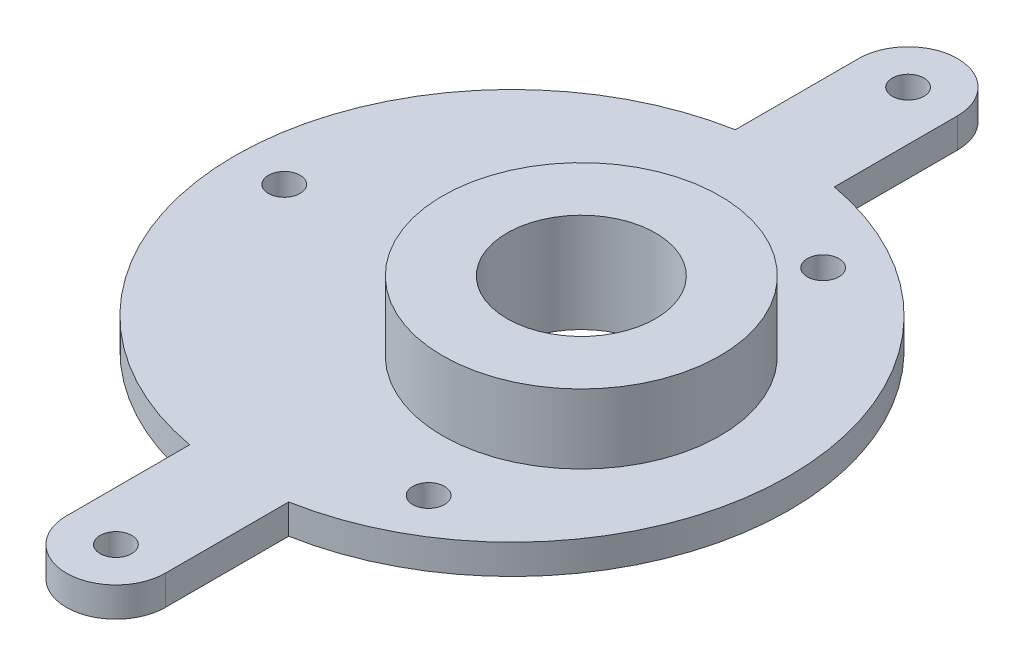
ISO-10303-21;
HEADER;
FILE_DESCRIPTION(('STEP AP214'),'2;1');
FILE_NAME('part.step','',(''),(''),'','','');
FILE_SCHEMA(('AUTOMOTIVE_DESIGN { 1 0 10303 214 1 1 1 1 }'));
ENDSEC;
DATA;
#1=APPLICATION_CONTEXT('core data for automotive mechanical design processes');
#2=APPLICATION_PROTOCOL_DEFINITION('international standard','automotive_design',2000,#1);
#3=PRODUCT_CONTEXT('',#1,'mechanical');
#4=PRODUCT('Part','Part','',(#3));
#5=PRODUCT_RELATED_PRODUCT_CATEGORY('part','',(#4));
#6=PRODUCT_DEFINITION_FORMATION('','',#4);
#7=PRODUCT_DEFINITION_CONTEXT('part definition',#1,'design');
#8=PRODUCT_DEFINITION('design','',#6,#7);
#9=PRODUCT_DEFINITION_SHAPE('','',#8);
#10=(LENGTH_UNIT() NAMED_UNIT(*) SI_UNIT(.MILLI.,.METRE.));
#11=(NAMED_UNIT(*) PLANE_ANGLE_UNIT() SI_UNIT($,.RADIAN.));
#12=(NAMED_UNIT(*) SI_UNIT($,.STERADIAN.) SOLID_ANGLE_UNIT());
#13=UNCERTAINTY_MEASURE_WITH_UNIT(LENGTH_MEASURE(1.E-05),#10,'distance_accuracy_value','');
#14=(GEOMETRIC_REPRESENTATION_CONTEXT(3) GLOBAL_UNCERTAINTY_ASSIGNED_CONTEXT((#13)) GLOBAL_UNIT_ASSIGNED_CONTEXT((#10,
#11,#12)) REPRESENTATION_CONTEXT('',''));
#15=CARTESIAN_POINT('',(0.,0.,0.));
#16=DIRECTION('',(0.,0.,1.));
#17=DIRECTION('',(1.,0.,0.));
#18=AXIS2_PLACEMENT_3D('',#15,#16,#17);
#19=CARTESIAN_POINT('',(0.,3.,0.));
#20=DIRECTION('',(0.,1.,0.));
#21=DIRECTION('',(0.,0.,1.));
#22=AXIS2_PLACEMENT_3D('',#19,#20,#21);
#23=PLANE('',#22);
#24=CARTESIAN_POINT('',(-23.,3.,0.));
#25=DIRECTION('',(0.,1.,0.));
#26=DIRECTION('',(0.,0.,1.));
#27=AXIS2_PLACEMENT_3D('',#24,#25,#26);
#28=CIRCLE('',#27,1.6);
#29=CARTESIAN_POINT('',(-23.,3.,1.6));
#30=VERTEX_POINT('',#29);
#31=EDGE_CURVE('E214',#30,#30,#28,.T.);
#32=ORIENTED_EDGE('',*,*,#31,.F.);
#33=EDGE_LOOP('',(#32));
#34=FACE_BOUND('',#33,.T.);
#35=CARTESIAN_POINT('',(11.5,3.,-19.9185842870421));
#36=DIRECTION('',(0.,1.,0.));
#37=DIRECTION('',(0.,0.,1.));
#38=AXIS2_PLACEMENT_3D('',#35,#36,#37);
#39=CIRCLE('',#38,1.6);
#40=CARTESIAN_POINT('',(11.5,3.,-18.3185842870421));
#41=VERTEX_POINT('',#40);
#42=EDGE_CURVE('E208',#41,#41,#39,.T.);
#43=ORIENTED_EDGE('',*,*,#42,.F.);
#44=EDGE_LOOP('',(#43));
#45=FACE_BOUND('',#44,.T.);
#46=CARTESIAN_POINT('',(11.5,3.,19.9185842870421));
#47=DIRECTION('',(0.,1.,0.));
#48=DIRECTION('',(0.,0.,1.));
#49=AXIS2_PLACEMENT_3D('',#46,#47,#48);
#50=CIRCLE('',#49,1.6);
#51=CARTESIAN_POINT('',(11.5,3.,21.5185842870421));
#52=VERTEX_POINT('',#51);
#53=EDGE_CURVE('E202',#52,#52,#50,.T.);
#54=ORIENTED_EDGE('',*,*,#53,.F.);
#55=EDGE_LOOP('',(#54));
#56=FACE_BOUND('',#55,.T.);
#57=CARTESIAN_POINT('',(7.,3.,0.));
#58=DIRECTION('',(0.,1.,0.));
#59=DIRECTION('',(0.,0.,1.));
#60=AXIS2_PLACEMENT_3D('',#57,#58,#59);
#61=CIRCLE('',#60,14.);
#62=CARTESIAN_POINT('',(7.,3.,14.));
#63=VERTEX_POINT('',#62);
#64=EDGE_CURVE('E190',#63,#63,#61,.T.);
#65=ORIENTED_EDGE('',*,*,#64,.F.);
#66=EDGE_LOOP('',(#65));
#67=FACE_BOUND('',#66,.T.);
#68=CARTESIAN_POINT('',(0.,3.,40.));
#69=DIRECTION('',(0.,1.,0.));
#70=DIRECTION('',(0.,0.,1.));
#71=AXIS2_PLACEMENT_3D('',#68,#69,#70);
#72=CIRCLE('',#71,1.6);
#73=CARTESIAN_POINT('',(0.,3.,41.6));
#74=VERTEX_POINT('',#73);
#75=EDGE_CURVE('E133',#74,#74,#72,.T.);
#76=ORIENTED_EDGE('',*,*,#75,.F.);
#77=EDGE_LOOP('',(#76));
#78=FACE_BOUND('',#77,.T.);
#79=CARTESIAN_POINT('',(0.,3.,0.));
#80=DIRECTION('',(0.,1.,0.));
#81=DIRECTION('',(0.,0.,1.));
#82=AXIS2_PLACEMENT_3D('',#79,#80,#81);
#83=CIRCLE('',#82,28.);
#84=CARTESIAN_POINT('',(5.,3.,27.5499546279118));
#85=VERTEX_POINT('',#84);
#86=CARTESIAN_POINT('',(5.,3.,-27.5499546279118));
#87=VERTEX_POINT('',#86);
#88=EDGE_CURVE('E144',#85,#87,#83,.T.);
#89=ORIENTED_EDGE('',*,*,#88,.T.);
#90=DIRECTION('',(0.,0.,-1.));
#91=VECTOR('',#90,1.);
#92=CARTESIAN_POINT('',(5.,3.,-40.));
#93=LINE('',#92,#91);
#94=CARTESIAN_POINT('',(5.,3.,-40.));
#95=VERTEX_POINT('',#94);
#96=EDGE_CURVE('E92',#87,#95,#93,.T.);
#97=ORIENTED_EDGE('',*,*,#96,.T.);
#98=CARTESIAN_POINT('',(0.,3.,-40.));
#99=DIRECTION('',(0.,1.,0.));
#100=DIRECTION('',(0.,0.,1.));
#101=AXIS2_PLACEMENT_3D('',#98,#99,#100);
#102=CIRCLE('',#101,5.);
#103=CARTESIAN_POINT('',(-5.,3.,-40.));
#104=VERTEX_POINT('',#103);
#105=EDGE_CURVE('E159',#95,#104,#102,.T.);
#106=ORIENTED_EDGE('',*,*,#105,.T.);
#107=DIRECTION('',(0.,0.,1.));
#108=VECTOR('',#107,1.);
#109=CARTESIAN_POINT('',(-5.,3.,-40.));
#110=LINE('',#109,#108);
#111=CARTESIAN_POINT('',(-5.,3.,-27.5499546279118));
#112=VERTEX_POINT('',#111);
#113=EDGE_CURVE('E172',#104,#112,#110,.T.);
#114=ORIENTED_EDGE('',*,*,#113,.T.);
#115=CARTESIAN_POINT('',(0.,3.,0.));
#116=DIRECTION('',(0.,1.,0.));
#117=DIRECTION('',(0.,0.,1.));
#118=AXIS2_PLACEMENT_3D('',#115,#116,#117);
#119=CIRCLE('',#118,28.);
#120=CARTESIAN_POINT('',(-5.,3.,27.5499546279118));
#121=VERTEX_POINT('',#120);
#122=EDGE_CURVE('E111',#112,#121,#119,.T.);
#123=ORIENTED_EDGE('',*,*,#122,.T.);
#124=DIRECTION('',(0.,0.,1.));
#125=VECTOR('',#124,1.);
#126=CARTESIAN_POINT('',(-5.,3.,27.5499546279118));
#127=LINE('',#126,#125);
#128=CARTESIAN_POINT('',(-5.,3.,40.));
#129=VERTEX_POINT('',#128);
#130=EDGE_CURVE('E105',#121,#129,#127,.T.);
#131=ORIENTED_EDGE('',*,*,#130,.T.);
#132=CARTESIAN_POINT('',(0.,3.,40.));
#133=DIRECTION('',(0.,1.,0.));
#134=DIRECTION('',(0.,0.,1.));
#135=AXIS2_PLACEMENT_3D('',#132,#133,#134);
#136=CIRCLE('',#135,5.);
#137=CARTESIAN_POINT('',(5.,3.,40.));
#138=VERTEX_POINT('',#137);
#139=EDGE_CURVE('E109',#129,#138,#136,.T.);
#140=ORIENTED_EDGE('',*,*,#139,.T.);
#141=DIRECTION('',(0.,0.,-1.));
#142=VECTOR('',#141,1.);
#143=CARTESIAN_POINT('',(5.,3.,27.5499546279118));
#144=LINE('',#143,#142);
#145=EDGE_CURVE('E49',#138,#85,#144,.T.);
#146=ORIENTED_EDGE('',*,*,#145,.T.);
#147=EDGE_LOOP('',(#89,#97,#106,#114,#123,#131,#140,#146));
#148=FACE_BOUND('',#147,.T.);
#149=CARTESIAN_POINT('',(0.,3.,-40.));
#150=DIRECTION('',(0.,1.,0.));
#151=DIRECTION('',(0.,0.,1.));
#152=AXIS2_PLACEMENT_3D('',#149,#150,#151);
#153=CIRCLE('',#152,1.6);
#154=CARTESIAN_POINT('',(0.,3.,-38.4));
#155=VERTEX_POINT('',#154);
#156=EDGE_CURVE('E181',#155,#155,#153,.T.);
#157=ORIENTED_EDGE('',*,*,#156,.F.);
#158=EDGE_LOOP('',(#157));
#159=FACE_BOUND('',#158,.T.);
#160=ADVANCED_FACE('F32',(#34,#45,#56,#67,#78,#148,#159),#23,.T.);
#161=CARTESIAN_POINT('',(0.,0.,0.));
#162=DIRECTION('',(0.,1.,0.));
#163=DIRECTION('',(0.,0.,1.));
#164=AXIS2_PLACEMENT_3D('',#161,#162,#163);
#165=PLANE('',#164);
#166=CARTESIAN_POINT('',(-23.,0.,0.));
#167=DIRECTION('',(0.,1.,0.));
#168=DIRECTION('',(0.,0.,1.));
#169=AXIS2_PLACEMENT_3D('',#166,#167,#168);
#170=CIRCLE('',#169,1.6);
#171=CARTESIAN_POINT('',(-23.,0.,1.6));
#172=VERTEX_POINT('',#171);
#173=EDGE_CURVE('E201',#172,#172,#170,.T.);
#174=ORIENTED_EDGE('',*,*,#173,.T.);
#175=EDGE_LOOP('',(#174));
#176=FACE_BOUND('',#175,.T.);
#177=CARTESIAN_POINT('',(11.5,0.,-19.9185842870421));
#178=DIRECTION('',(0.,1.,0.));
#179=DIRECTION('',(0.,0.,1.));
#180=AXIS2_PLACEMENT_3D('',#177,#178,#179);
#181=CIRCLE('',#180,1.6);
#182=CARTESIAN_POINT('',(11.5,0.,-18.3185842870421));
#183=VERTEX_POINT('',#182);
#184=EDGE_CURVE('E211',#183,#183,#181,.T.);
#185=ORIENTED_EDGE('',*,*,#184,.T.);
#186=EDGE_LOOP('',(#185));
#187=FACE_BOUND('',#186,.T.);
#188=CARTESIAN_POINT('',(11.5,0.,19.9185842870421));
#189=DIRECTION('',(0.,1.,0.));
#190=DIRECTION('',(0.,0.,1.));
#191=AXIS2_PLACEMENT_3D('',#188,#189,#190);
#192=CIRCLE('',#191,1.6);
#193=CARTESIAN_POINT('',(11.5,0.,21.5185842870421));
#194=VERTEX_POINT('',#193);
#195=EDGE_CURVE('E205',#194,#194,#192,.T.);
#196=ORIENTED_EDGE('',*,*,#195,.T.);
#197=EDGE_LOOP('',(#196));
#198=FACE_BOUND('',#197,.T.);
#199=CARTESIAN_POINT('',(7.,0.,0.));
#200=DIRECTION('',(0.,1.,0.));
#201=DIRECTION('',(0.,0.,1.));
#202=AXIS2_PLACEMENT_3D('',#199,#200,#201);
#203=CIRCLE('',#202,7.5);
#204=CARTESIAN_POINT('',(7.,0.,7.5));
#205=VERTEX_POINT('',#204);
#206=EDGE_CURVE('E193',#205,#205,#203,.T.);
#207=ORIENTED_EDGE('',*,*,#206,.T.);
#208=EDGE_LOOP('',(#207));
#209=FACE_BOUND('',#208,.T.);
#210=CARTESIAN_POINT('',(0.,0.,0.));
#211=DIRECTION('',(0.,1.,0.));
#212=DIRECTION('',(0.,0.,1.));
#213=AXIS2_PLACEMENT_3D('',#210,#211,#212);
#214=CIRCLE('',#213,28.);
#215=CARTESIAN_POINT('',(5.,0.,27.5499546279118));
#216=VERTEX_POINT('',#215);
#217=CARTESIAN_POINT('',(5.,0.,-27.5499546279118));
#218=VERTEX_POINT('',#217);
#219=EDGE_CURVE('E129',#216,#218,#214,.T.);
#220=ORIENTED_EDGE('',*,*,#219,.F.);
#221=DIRECTION('',(0.,0.,-1.));
#222=VECTOR('',#221,1.);
#223=CARTESIAN_POINT('',(5.,0.,27.5499546279118));
#224=LINE('',#223,#222);
#225=CARTESIAN_POINT('',(5.,0.,40.));
#226=VERTEX_POINT('',#225);
#227=EDGE_CURVE('E84',#226,#216,#224,.T.);
#228=ORIENTED_EDGE('',*,*,#227,.F.);
#229=CARTESIAN_POINT('',(0.,0.,40.));
#230=DIRECTION('',(0.,1.,0.));
#231=DIRECTION('',(0.,0.,1.));
#232=AXIS2_PLACEMENT_3D('',#229,#230,#231);
#233=CIRCLE('',#232,5.);
#234=CARTESIAN_POINT('',(-5.,0.,40.));
#235=VERTEX_POINT('',#234);
#236=EDGE_CURVE('E78',#235,#226,#233,.T.);
#237=ORIENTED_EDGE('',*,*,#236,.F.);
#238=DIRECTION('',(0.,0.,1.));
#239=VECTOR('',#238,1.);
#240=CARTESIAN_POINT('',(-5.,0.,27.5499546279118));
#241=LINE('',#240,#239);
#242=CARTESIAN_POINT('',(-5.,0.,27.5499546279118));
#243=VERTEX_POINT('',#242);
#244=EDGE_CURVE('E119',#243,#235,#241,.T.);
#245=ORIENTED_EDGE('',*,*,#244,.F.);
#246=CARTESIAN_POINT('',(0.,0.,0.));
#247=DIRECTION('',(0.,1.,0.));
#248=DIRECTION('',(0.,0.,1.));
#249=AXIS2_PLACEMENT_3D('',#246,#247,#248);
#250=CIRCLE('',#249,28.);
#251=CARTESIAN_POINT('',(-5.,0.,-27.5499546279118));
#252=VERTEX_POINT('',#251);
#253=EDGE_CURVE('E139',#252,#243,#250,.T.);
#254=ORIENTED_EDGE('',*,*,#253,.F.);
#255=DIRECTION('',(0.,0.,1.));
#256=VECTOR('',#255,1.);
#257=CARTESIAN_POINT('',(-5.,0.,-40.));
#258=LINE('',#257,#256);
#259=CARTESIAN_POINT('',(-5.,0.,-40.));
#260=VERTEX_POINT('',#259);
#261=EDGE_CURVE('E137',#260,#252,#258,.T.);
#262=ORIENTED_EDGE('',*,*,#261,.F.);
#263=CARTESIAN_POINT('',(0.,0.,-40.));
#264=DIRECTION('',(0.,1.,0.));
#265=DIRECTION('',(0.,0.,1.));
#266=AXIS2_PLACEMENT_3D('',#263,#264,#265);
#267=CIRCLE('',#266,5.);
#268=CARTESIAN_POINT('',(5.,0.,-40.));
#269=VERTEX_POINT('',#268);
#270=EDGE_CURVE('E135',#269,#260,#267,.T.);
#271=ORIENTED_EDGE('',*,*,#270,.F.);
#272=DIRECTION('',(0.,0.,-1.));
#273=VECTOR('',#272,1.);
#274=CARTESIAN_POINT('',(5.,0.,-40.));
#275=LINE('',#274,#273);
#276=EDGE_CURVE('E132',#218,#269,#275,.T.);
#277=ORIENTED_EDGE('',*,*,#276,.F.);
#278=EDGE_LOOP('',(#220,#228,#237,#245,#254,#262,#271,#277));
#279=FACE_BOUND('',#278,.T.);
#280=CARTESIAN_POINT('',(0.,0.,40.));
#281=DIRECTION('',(0.,1.,0.));
#282=DIRECTION('',(0.,0.,1.));
#283=AXIS2_PLACEMENT_3D('',#280,#281,#282);
#284=CIRCLE('',#283,1.6);
#285=CARTESIAN_POINT('',(0.,0.,41.6));
#286=VERTEX_POINT('',#285);
#287=EDGE_CURVE('E178',#286,#286,#284,.T.);
#288=ORIENTED_EDGE('',*,*,#287,.T.);
#289=EDGE_LOOP('',(#288));
#290=FACE_BOUND('',#289,.T.);
#291=CARTESIAN_POINT('',(0.,0.,-40.));
#292=DIRECTION('',(0.,1.,0.));
#293=DIRECTION('',(0.,0.,1.));
#294=AXIS2_PLACEMENT_3D('',#291,#292,#293);
#295=CIRCLE('',#294,1.6);
#296=CARTESIAN_POINT('',(0.,0.,-38.4));
#297=VERTEX_POINT('',#296);
#298=EDGE_CURVE('E184',#297,#297,#295,.T.);
#299=ORIENTED_EDGE('',*,*,#298,.T.);
#300=EDGE_LOOP('',(#299));
#301=FACE_BOUND('',#300,.T.);
#302=ADVANCED_FACE('F163',(#176,#187,#198,#209,#279,#290,#301),#165,.F.);
#303=CARTESIAN_POINT('',(0.,3.,0.));
#304=DIRECTION('',(0.,-1.,0.));
#305=DIRECTION('',(0.,0.,-1.));
#306=AXIS2_PLACEMENT_3D('',#303,#304,#305);
#307=CYLINDRICAL_SURFACE('',#306,28.);
#308=ORIENTED_EDGE('',*,*,#219,.T.);
#309=DIRECTION('',(0.,-1.,0.));
#310=VECTOR('',#309,1.);
#311=CARTESIAN_POINT('',(5.,3.,-27.5499546279118));
#312=LINE('',#311,#310);
#313=EDGE_CURVE('E11',#87,#218,#312,.T.);
#314=ORIENTED_EDGE('',*,*,#313,.F.);
#315=ORIENTED_EDGE('',*,*,#88,.F.);
#316=DIRECTION('',(0.,-1.,0.));
#317=VECTOR('',#316,1.);
#318=CARTESIAN_POINT('',(5.,3.,27.5499546279118));
#319=LINE('',#318,#317);
#320=EDGE_CURVE('E125',#85,#216,#319,.T.);
#321=ORIENTED_EDGE('',*,*,#320,.T.);
#322=EDGE_LOOP('',(#308,#314,#315,#321));
#323=FACE_BOUND('',#322,.T.);
#324=ADVANCED_FACE('F34',(#323),#307,.T.);
#325=CARTESIAN_POINT('',(5.,3.,-40.));
#326=DIRECTION('',(-1.,0.,0.));
#327=DIRECTION('',(0.,0.,1.));
#328=AXIS2_PLACEMENT_3D('',#325,#326,#327);
#329=PLANE('',#328);
#330=ORIENTED_EDGE('',*,*,#276,.T.);
#331=DIRECTION('',(0.,-1.,0.));
#332=VECTOR('',#331,1.);
#333=CARTESIAN_POINT('',(5.,3.,-40.));
#334=LINE('',#333,#332);
#335=EDGE_CURVE('E41',#95,#269,#334,.T.);
#336=ORIENTED_EDGE('',*,*,#335,.F.);
#337=ORIENTED_EDGE('',*,*,#96,.F.);
#338=ORIENTED_EDGE('',*,*,#313,.T.);
#339=EDGE_LOOP('',(#330,#336,#337,#338));
#340=FACE_BOUND('',#339,.T.);
#341=ADVANCED_FACE('F275',(#340),#329,.F.);
#342=CARTESIAN_POINT('',(0.,3.,-40.));
#343=DIRECTION('',(0.,-1.,0.));
#344=DIRECTION('',(0.,0.,-1.));
#345=AXIS2_PLACEMENT_3D('',#342,#343,#344);
#346=CYLINDRICAL_SURFACE('',#345,5.);
#347=ORIENTED_EDGE('',*,*,#270,.T.);
#348=DIRECTION('',(0.,-1.,0.));
#349=VECTOR('',#348,1.);
#350=CARTESIAN_POINT('',(-5.,3.,-40.));
#351=LINE('',#350,#349);
#352=EDGE_CURVE('E151',#104,#260,#351,.T.);
#353=ORIENTED_EDGE('',*,*,#352,.F.);
#354=ORIENTED_EDGE('',*,*,#105,.F.);
#355=ORIENTED_EDGE('',*,*,#335,.T.);
#356=EDGE_LOOP('',(#347,#353,#354,#355));
#357=FACE_BOUND('',#356,.T.);
#358=ADVANCED_FACE('F157',(#357),#346,.T.);
#359=CARTESIAN_POINT('',(-5.,3.,-40.));
#360=DIRECTION('',(1.,0.,0.));
#361=DIRECTION('',(0.,0.,-1.));
#362=AXIS2_PLACEMENT_3D('',#359,#360,#361);
#363=PLANE('',#362);
#364=ORIENTED_EDGE('',*,*,#261,.T.);
#365=DIRECTION('',(0.,-1.,0.));
#366=VECTOR('',#365,1.);
#367=CARTESIAN_POINT('',(-5.,3.,-27.5499546279118));
#368=LINE('',#367,#366);
#369=EDGE_CURVE('E148',#112,#252,#368,.T.);
#370=ORIENTED_EDGE('',*,*,#369,.F.);
#371=ORIENTED_EDGE('',*,*,#113,.F.);
#372=ORIENTED_EDGE('',*,*,#352,.T.);
#373=EDGE_LOOP('',(#364,#370,#371,#372));
#374=FACE_BOUND('',#373,.T.);
#375=ADVANCED_FACE('F168',(#374),#363,.F.);
#376=CARTESIAN_POINT('',(0.,3.,0.));
#377=DIRECTION('',(0.,-1.,0.));
#378=DIRECTION('',(0.,0.,-1.));
#379=AXIS2_PLACEMENT_3D('',#376,#377,#378);
#380=CYLINDRICAL_SURFACE('',#379,28.);
#381=ORIENTED_EDGE('',*,*,#253,.T.);
#382=DIRECTION('',(0.,-1.,0.));
#383=VECTOR('',#382,1.);
#384=CARTESIAN_POINT('',(-5.,3.,27.5499546279118));
#385=LINE('',#384,#383);
#386=EDGE_CURVE('E120',#121,#243,#385,.T.);
#387=ORIENTED_EDGE('',*,*,#386,.F.);
#388=ORIENTED_EDGE('',*,*,#122,.F.);
#389=ORIENTED_EDGE('',*,*,#369,.T.);
#390=EDGE_LOOP('',(#381,#387,#388,#389));
#391=FACE_BOUND('',#390,.T.);
#392=ADVANCED_FACE('F171',(#391),#380,.T.);
#393=CARTESIAN_POINT('',(-5.,3.,27.5499546279118));
#394=DIRECTION('',(1.,0.,0.));
#395=DIRECTION('',(0.,0.,-1.));
#396=AXIS2_PLACEMENT_3D('',#393,#394,#395);
#397=PLANE('',#396);
#398=ORIENTED_EDGE('',*,*,#244,.T.);
#399=DIRECTION('',(0.,-1.,0.));
#400=VECTOR('',#399,1.);
#401=CARTESIAN_POINT('',(-5.,3.,40.));
#402=LINE('',#401,#400);
#403=EDGE_CURVE('E116',#129,#235,#402,.T.);
#404=ORIENTED_EDGE('',*,*,#403,.F.);
#405=ORIENTED_EDGE('',*,*,#130,.F.);
#406=ORIENTED_EDGE('',*,*,#386,.T.);
#407=EDGE_LOOP('',(#398,#404,#405,#406));
#408=FACE_BOUND('',#407,.T.);
#409=ADVANCED_FACE('F117',(#408),#397,.F.);
#410=CARTESIAN_POINT('',(0.,3.,40.));
#411=DIRECTION('',(0.,-1.,0.));
#412=DIRECTION('',(0.,0.,-1.));
#413=AXIS2_PLACEMENT_3D('',#410,#411,#412);
#414=CYLINDRICAL_SURFACE('',#413,5.);
#415=ORIENTED_EDGE('',*,*,#236,.T.);
#416=DIRECTION('',(0.,-1.,0.));
#417=VECTOR('',#416,1.);
#418=CARTESIAN_POINT('',(5.,3.,40.));
#419=LINE('',#418,#417);
#420=EDGE_CURVE('E121',#138,#226,#419,.T.);
#421=ORIENTED_EDGE('',*,*,#420,.F.);
#422=ORIENTED_EDGE('',*,*,#139,.F.);
#423=ORIENTED_EDGE('',*,*,#403,.T.);
#424=EDGE_LOOP('',(#415,#421,#422,#423));
#425=FACE_BOUND('',#424,.T.);
#426=ADVANCED_FACE('F123',(#425),#414,.T.);
#427=CARTESIAN_POINT('',(5.,3.,27.5499546279118));
#428=DIRECTION('',(-1.,0.,0.));
#429=DIRECTION('',(0.,0.,1.));
#430=AXIS2_PLACEMENT_3D('',#427,#428,#429);
#431=PLANE('',#430);
#432=ORIENTED_EDGE('',*,*,#227,.T.);
#433=ORIENTED_EDGE('',*,*,#320,.F.);
#434=ORIENTED_EDGE('',*,*,#145,.F.);
#435=ORIENTED_EDGE('',*,*,#420,.T.);
#436=EDGE_LOOP('',(#432,#433,#434,#435));
#437=FACE_BOUND('',#436,.T.);
#438=ADVANCED_FACE('F244',(#437),#431,.F.);
#439=CARTESIAN_POINT('',(0.,3.,40.));
#440=DIRECTION('',(0.,-1.,0.));
#441=DIRECTION('',(0.,0.,-1.));
#442=AXIS2_PLACEMENT_3D('',#439,#440,#441);
#443=CYLINDRICAL_SURFACE('',#442,1.6);
#444=ORIENTED_EDGE('',*,*,#75,.T.);
#445=EDGE_LOOP('',(#444));
#446=FACE_BOUND('',#445,.T.);
#447=ORIENTED_EDGE('',*,*,#287,.F.);
#448=EDGE_LOOP('',(#447));
#449=FACE_BOUND('',#448,.T.);
#450=ADVANCED_FACE('F240',(#446,#449),#443,.F.);
#451=CARTESIAN_POINT('',(0.,3.,-40.));
#452=DIRECTION('',(0.,-1.,0.));
#453=DIRECTION('',(0.,0.,-1.));
#454=AXIS2_PLACEMENT_3D('',#451,#452,#453);
#455=CYLINDRICAL_SURFACE('',#454,1.6);
#456=ORIENTED_EDGE('',*,*,#156,.T.);
#457=EDGE_LOOP('',(#456));
#458=FACE_BOUND('',#457,.T.);
#459=ORIENTED_EDGE('',*,*,#298,.F.);
#460=EDGE_LOOP('',(#459));
#461=FACE_BOUND('',#460,.T.);
#462=ADVANCED_FACE('F243',(#458,#461),#455,.F.);
#463=CARTESIAN_POINT('',(7.,10.,0.));
#464=DIRECTION('',(0.,-1.,0.));
#465=DIRECTION('',(0.,0.,-1.));
#466=AXIS2_PLACEMENT_3D('',#463,#464,#465);
#467=CYLINDRICAL_SURFACE('',#466,14.);
#468=CARTESIAN_POINT('',(7.,10.,0.));
#469=DIRECTION('',(0.,1.,0.));
#470=DIRECTION('',(0.,0.,1.));
#471=AXIS2_PLACEMENT_3D('',#468,#469,#470);
#472=CIRCLE('',#471,14.);
#473=CARTESIAN_POINT('',(7.,10.,14.));
#474=VERTEX_POINT('',#473);
#475=EDGE_CURVE('E187',#474,#474,#472,.T.);
#476=ORIENTED_EDGE('',*,*,#475,.F.);
#477=EDGE_LOOP('',(#476));
#478=FACE_BOUND('',#477,.T.);
#479=ORIENTED_EDGE('',*,*,#64,.T.);
#480=EDGE_LOOP('',(#479));
#481=FACE_BOUND('',#480,.T.);
#482=ADVANCED_FACE('F253',(#478,#481),#467,.T.);
#483=CARTESIAN_POINT('',(7.,10.,0.));
#484=DIRECTION('',(0.,1.,0.));
#485=DIRECTION('',(0.,0.,1.));
#486=AXIS2_PLACEMENT_3D('',#483,#484,#485);
#487=PLANE('',#486);
#488=CARTESIAN_POINT('',(7.,10.,0.));
#489=DIRECTION('',(0.,1.,0.));
#490=DIRECTION('',(0.,0.,1.));
#491=AXIS2_PLACEMENT_3D('',#488,#489,#490);
#492=CIRCLE('',#491,7.5);
#493=CARTESIAN_POINT('',(7.,10.,7.5));
#494=VERTEX_POINT('',#493);
#495=EDGE_CURVE('E198',#494,#494,#492,.T.);
#496=ORIENTED_EDGE('',*,*,#495,.F.);
#497=EDGE_LOOP('',(#496));
#498=FACE_BOUND('',#497,.T.);
#499=ORIENTED_EDGE('',*,*,#475,.T.);
#500=EDGE_LOOP('',(#499));
#501=FACE_BOUND('',#500,.T.);
#502=ADVANCED_FACE('F259',(#498,#501),#487,.T.);
#503=CARTESIAN_POINT('',(7.,0.,0.));
#504=DIRECTION('',(0.,1.,0.));
#505=DIRECTION('',(0.,0.,1.));
#506=AXIS2_PLACEMENT_3D('',#503,#504,#505);
#507=CYLINDRICAL_SURFACE('',#506,7.5);
#508=ORIENTED_EDGE('',*,*,#206,.F.);
#509=EDGE_LOOP('',(#508));
#510=FACE_BOUND('',#509,.T.);
#511=ORIENTED_EDGE('',*,*,#495,.T.);
#512=EDGE_LOOP('',(#511));
#513=FACE_BOUND('',#512,.T.);
#514=ADVANCED_FACE('F299',(#510,#513),#507,.F.);
#515=CARTESIAN_POINT('',(11.5,0.,19.9185842870421));
#516=DIRECTION('',(0.,1.,0.));
#517=DIRECTION('',(0.,0.,1.));
#518=AXIS2_PLACEMENT_3D('',#515,#516,#517);
#519=CYLINDRICAL_SURFACE('',#518,1.6);
#520=ORIENTED_EDGE('',*,*,#195,.F.);
#521=EDGE_LOOP('',(#520));
#522=FACE_BOUND('',#521,.T.);
#523=ORIENTED_EDGE('',*,*,#53,.T.);
#524=EDGE_LOOP('',(#523));
#525=FACE_BOUND('',#524,.T.);
#526=ADVANCED_FACE('F304',(#522,#525),#519,.F.);
#527=CARTESIAN_POINT('',(11.5,0.,-19.9185842870421));
#528=DIRECTION('',(0.,1.,0.));
#529=DIRECTION('',(0.,0.,1.));
#530=AXIS2_PLACEMENT_3D('',#527,#528,#529);
#531=CYLINDRICAL_SURFACE('',#530,1.6);
#532=ORIENTED_EDGE('',*,*,#184,.F.);
#533=EDGE_LOOP('',(#532));
#534=FACE_BOUND('',#533,.T.);
#535=ORIENTED_EDGE('',*,*,#42,.T.);
#536=EDGE_LOOP('',(#535));
#537=FACE_BOUND('',#536,.T.);
#538=ADVANCED_FACE('F225',(#534,#537),#531,.F.);
#539=CARTESIAN_POINT('',(-23.,0.,0.));
#540=DIRECTION('',(0.,1.,0.));
#541=DIRECTION('',(0.,0.,1.));
#542=AXIS2_PLACEMENT_3D('',#539,#540,#541);
#543=CYLINDRICAL_SURFACE('',#542,1.6);
#544=ORIENTED_EDGE('',*,*,#173,.F.);
#545=EDGE_LOOP('',(#544));
#546=FACE_BOUND('',#545,.T.);
#547=ORIENTED_EDGE('',*,*,#31,.T.);
#548=EDGE_LOOP('',(#547));
#549=FACE_BOUND('',#548,.T.);
#550=ADVANCED_FACE('F222',(#546,#549),#543,.F.);
#551=CLOSED_SHELL('',(#160,#302,#324,#341,#358,#375,#392,#409,#426,#438,#450,#462,#482,#502,
#514,#526,#538,#550));
#552=MANIFOLD_SOLID_BREP('B2',#551);
#553=ADVANCED_BREP_SHAPE_REPRESENTATION('',(#18,#552),#14);
#554=SHAPE_DEFINITION_REPRESENTATION(#9,#553);
ENDSEC;
END-ISO-10303-21;
